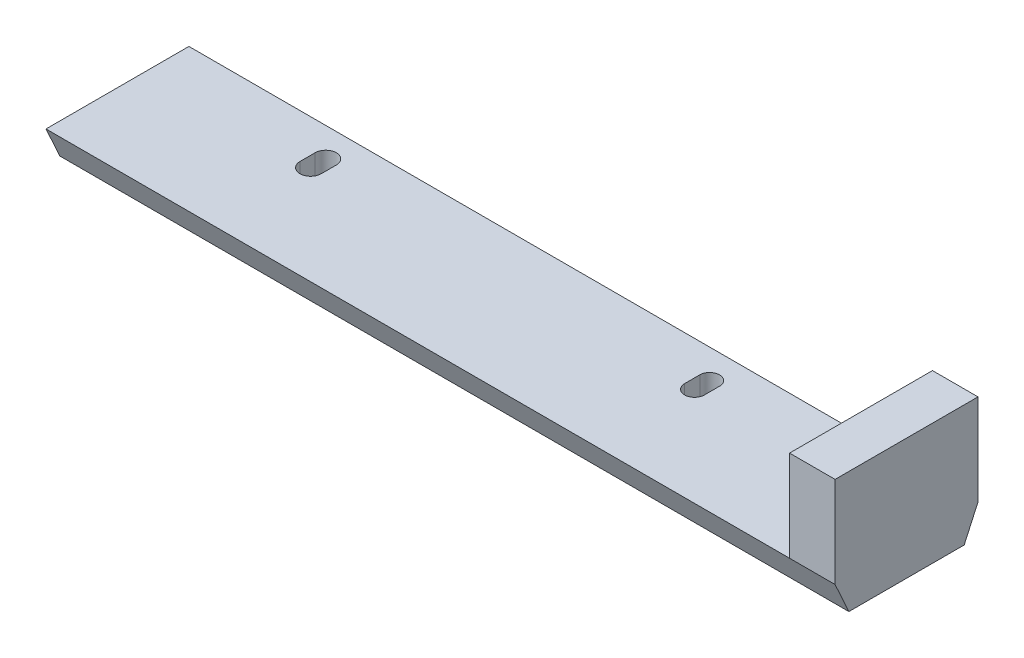
ISO-10303-21;
HEADER;
FILE_DESCRIPTION(('STEP AP214'),'2;1');
FILE_NAME('part.step','',(''),(''),'','','');
FILE_SCHEMA(('AUTOMOTIVE_DESIGN { 1 0 10303 214 1 1 1 1 }'));
ENDSEC;
DATA;
#1=APPLICATION_CONTEXT('core data for automotive mechanical design processes');
#2=APPLICATION_PROTOCOL_DEFINITION('international standard','automotive_design',2000,#1);
#3=PRODUCT_CONTEXT('',#1,'mechanical');
#4=PRODUCT('Part','Part','',(#3));
#5=PRODUCT_RELATED_PRODUCT_CATEGORY('part','',(#4));
#6=PRODUCT_DEFINITION_FORMATION('','',#4);
#7=PRODUCT_DEFINITION_CONTEXT('part definition',#1,'design');
#8=PRODUCT_DEFINITION('design','',#6,#7);
#9=PRODUCT_DEFINITION_SHAPE('','',#8);
#10=(LENGTH_UNIT() NAMED_UNIT(*) SI_UNIT(.MILLI.,.METRE.));
#11=(NAMED_UNIT(*) PLANE_ANGLE_UNIT() SI_UNIT($,.RADIAN.));
#12=(NAMED_UNIT(*) SI_UNIT($,.STERADIAN.) SOLID_ANGLE_UNIT());
#13=UNCERTAINTY_MEASURE_WITH_UNIT(LENGTH_MEASURE(1.E-05),#10,'distance_accuracy_value','');
#14=(GEOMETRIC_REPRESENTATION_CONTEXT(3) GLOBAL_UNCERTAINTY_ASSIGNED_CONTEXT((#13)) GLOBAL_UNIT_ASSIGNED_CONTEXT((#10,
#11,#12)) REPRESENTATION_CONTEXT('',''));
#15=CARTESIAN_POINT('',(0.,0.,0.));
#16=DIRECTION('',(0.,0.,1.));
#17=DIRECTION('',(1.,0.,0.));
#18=AXIS2_PLACEMENT_3D('',#15,#16,#17);
#19=CARTESIAN_POINT('',(0.,2.,0.));
#20=DIRECTION('',(0.,-1.,0.));
#21=DIRECTION('',(0.,0.,-1.));
#22=AXIS2_PLACEMENT_3D('',#19,#20,#21);
#23=PLANE('',#22);
#24=DIRECTION('',(0.,0.,1.));
#25=VECTOR('',#24,1.);
#26=CARTESIAN_POINT('',(10.2263631920337,2.,2.20000000000115));
#27=LINE('',#26,#25);
#28=CARTESIAN_POINT('',(10.2263631920337,2.,2.20000000000115));
#29=VERTEX_POINT('',#28);
#30=CARTESIAN_POINT('',(10.2263631920337,2.,3.20000000000115));
#31=VERTEX_POINT('',#30);
#32=EDGE_CURVE('E239',#29,#31,#27,.T.);
#33=ORIENTED_EDGE('',*,*,#32,.F.);
#34=CARTESIAN_POINT('',(10.9263631920337,2.,2.20000000000115));
#35=DIRECTION('',(0.,1.,0.));
#36=DIRECTION('',(0.,0.,1.));
#37=AXIS2_PLACEMENT_3D('',#34,#35,#36);
#38=CIRCLE('',#37,0.699999999999999);
#39=CARTESIAN_POINT('',(11.6263631920337,2.,2.20000000000115));
#40=VERTEX_POINT('',#39);
#41=EDGE_CURVE('E205',#40,#29,#38,.T.);
#42=ORIENTED_EDGE('',*,*,#41,.F.);
#43=DIRECTION('',(0.,0.,-1.));
#44=VECTOR('',#43,1.);
#45=CARTESIAN_POINT('',(11.6263631920337,2.,2.20000000000115));
#46=LINE('',#45,#44);
#47=CARTESIAN_POINT('',(11.6263631920337,2.,3.20000000000115));
#48=VERTEX_POINT('',#47);
#49=EDGE_CURVE('E232',#48,#40,#46,.T.);
#50=ORIENTED_EDGE('',*,*,#49,.F.);
#51=CARTESIAN_POINT('',(10.9263631920337,2.,3.20000000000115));
#52=DIRECTION('',(0.,1.,0.));
#53=DIRECTION('',(0.,0.,1.));
#54=AXIS2_PLACEMENT_3D('',#51,#52,#53);
#55=CIRCLE('',#54,0.699999999999999);
#56=EDGE_CURVE('E236',#31,#48,#55,.T.);
#57=ORIENTED_EDGE('',*,*,#56,.F.);
#58=EDGE_LOOP('',(#33,#42,#50,#57));
#59=FACE_BOUND('',#58,.T.);
#60=DIRECTION('',(0.,0.,1.));
#61=VECTOR('',#60,1.);
#62=CARTESIAN_POINT('',(35.5763631920337,2.,2.20000000000115));
#63=LINE('',#62,#61);
#64=CARTESIAN_POINT('',(35.5763631920337,2.,2.20000000000115));
#65=VERTEX_POINT('',#64);
#66=CARTESIAN_POINT('',(35.5763631920337,2.,3.20000000000115));
#67=VERTEX_POINT('',#66);
#68=EDGE_CURVE('E206',#65,#67,#63,.T.);
#69=ORIENTED_EDGE('',*,*,#68,.F.);
#70=CARTESIAN_POINT('',(36.2263631920337,2.,2.20000000000115));
#71=DIRECTION('',(0.,1.,0.));
#72=DIRECTION('',(0.,0.,1.));
#73=AXIS2_PLACEMENT_3D('',#70,#71,#72);
#74=CIRCLE('',#73,0.650000000000005);
#75=CARTESIAN_POINT('',(36.8763631920338,2.,2.20000000000115));
#76=VERTEX_POINT('',#75);
#77=EDGE_CURVE('E203',#76,#65,#74,.T.);
#78=ORIENTED_EDGE('',*,*,#77,.F.);
#79=DIRECTION('',(0.,0.,-1.));
#80=VECTOR('',#79,1.);
#81=CARTESIAN_POINT('',(36.8763631920338,2.,2.20000000000115));
#82=LINE('',#81,#80);
#83=CARTESIAN_POINT('',(36.8763631920338,2.,3.20000000000115));
#84=VERTEX_POINT('',#83);
#85=EDGE_CURVE('E192',#84,#76,#82,.T.);
#86=ORIENTED_EDGE('',*,*,#85,.F.);
#87=CARTESIAN_POINT('',(36.2263631920337,2.,3.20000000000115));
#88=DIRECTION('',(0.,1.,0.));
#89=DIRECTION('',(0.,0.,1.));
#90=AXIS2_PLACEMENT_3D('',#87,#88,#89);
#91=CIRCLE('',#90,0.650000000000005);
#92=EDGE_CURVE('E209',#67,#84,#91,.T.);
#93=ORIENTED_EDGE('',*,*,#92,.F.);
#94=EDGE_LOOP('',(#69,#78,#86,#93));
#95=FACE_BOUND('',#94,.T.);
#96=DIRECTION('',(0.,0.,1.));
#97=VECTOR('',#96,1.);
#98=CARTESIAN_POINT('',(49.,2.,0.));
#99=LINE('',#98,#97);
#100=CARTESIAN_POINT('',(49.,2.,0.290909090909087));
#101=VERTEX_POINT('',#100);
#102=CARTESIAN_POINT('',(49.,2.,9.70909090909091));
#103=VERTEX_POINT('',#102);
#104=EDGE_CURVE('E164',#101,#103,#99,.T.);
#105=ORIENTED_EDGE('',*,*,#104,.F.);
#106=DIRECTION('',(1.,0.,0.));
#107=VECTOR('',#106,1.);
#108=CARTESIAN_POINT('',(0.,2.,0.290909090909087));
#109=LINE('',#108,#107);
#110=CARTESIAN_POINT('',(0.,2.,0.290909090909087));
#111=VERTEX_POINT('',#110);
#112=EDGE_CURVE('E148',#111,#101,#109,.T.);
#113=ORIENTED_EDGE('',*,*,#112,.F.);
#114=DIRECTION('',(0.,0.,1.));
#115=VECTOR('',#114,1.);
#116=CARTESIAN_POINT('',(0.,2.,10.));
#117=LINE('',#116,#115);
#118=CARTESIAN_POINT('',(0.,2.,9.70909090909091));
#119=VERTEX_POINT('',#118);
#120=EDGE_CURVE('E162',#111,#119,#117,.T.);
#121=ORIENTED_EDGE('',*,*,#120,.T.);
#122=DIRECTION('',(1.,0.,0.));
#123=VECTOR('',#122,1.);
#124=CARTESIAN_POINT('',(0.,2.,9.70909090909091));
#125=LINE('',#124,#123);
#126=EDGE_CURVE('E264',#119,#103,#125,.T.);
#127=ORIENTED_EDGE('',*,*,#126,.T.);
#128=EDGE_LOOP('',(#105,#113,#121,#127));
#129=FACE_BOUND('',#128,.T.);
#130=ADVANCED_FACE('F39',(#59,#95,#129),#23,.F.);
#131=CARTESIAN_POINT('',(52.,2.,10.));
#132=DIRECTION('',(-1.,0.,0.));
#133=DIRECTION('',(0.,0.,1.));
#134=AXIS2_PLACEMENT_3D('',#131,#132,#133);
#135=PLANE('',#134);
#136=DIRECTION('',(0.,-0.910366477462604,0.413802944301185));
#137=VECTOR('',#136,1.);
#138=CARTESIAN_POINT('',(52.,2.,0.290909090909087));
#139=LINE('',#138,#137);
#140=CARTESIAN_POINT('',(52.,2.,0.290909090909087));
#141=VERTEX_POINT('',#140);
#142=CARTESIAN_POINT('',(52.,0.,1.2));
#143=VERTEX_POINT('',#142);
#144=EDGE_CURVE('E156',#141,#143,#139,.T.);
#145=ORIENTED_EDGE('',*,*,#144,.F.);
#146=DIRECTION('',(0.,-1.,0.));
#147=VECTOR('',#146,1.);
#148=CARTESIAN_POINT('',(52.,2.,0.290909090909087));
#149=LINE('',#148,#147);
#150=CARTESIAN_POINT('',(52.,8.,0.290909090909087));
#151=VERTEX_POINT('',#150);
#152=EDGE_CURVE('E261',#151,#141,#149,.T.);
#153=ORIENTED_EDGE('',*,*,#152,.F.);
#154=DIRECTION('',(0.,0.,-1.));
#155=VECTOR('',#154,1.);
#156=CARTESIAN_POINT('',(52.,8.,0.));
#157=LINE('',#156,#155);
#158=CARTESIAN_POINT('',(52.,8.,9.70909090909091));
#159=VERTEX_POINT('',#158);
#160=EDGE_CURVE('E183',#159,#151,#157,.T.);
#161=ORIENTED_EDGE('',*,*,#160,.F.);
#162=DIRECTION('',(0.,1.,0.));
#163=VECTOR('',#162,1.);
#164=CARTESIAN_POINT('',(52.,8.,9.70909090909091));
#165=LINE('',#164,#163);
#166=CARTESIAN_POINT('',(52.,2.,9.70909090909091));
#167=VERTEX_POINT('',#166);
#168=EDGE_CURVE('E61',#167,#159,#165,.T.);
#169=ORIENTED_EDGE('',*,*,#168,.F.);
#170=DIRECTION('',(0.,0.910366477462604,0.413802944301186));
#171=VECTOR('',#170,1.);
#172=CARTESIAN_POINT('',(52.,2.,9.70909090909091));
#173=LINE('',#172,#171);
#174=CARTESIAN_POINT('',(52.,0.,8.8));
#175=VERTEX_POINT('',#174);
#176=EDGE_CURVE('E258',#175,#167,#173,.T.);
#177=ORIENTED_EDGE('',*,*,#176,.F.);
#178=DIRECTION('',(0.,0.,-1.));
#179=VECTOR('',#178,1.);
#180=CARTESIAN_POINT('',(52.,0.,10.));
#181=LINE('',#180,#179);
#182=EDGE_CURVE('E171',#175,#143,#181,.T.);
#183=ORIENTED_EDGE('',*,*,#182,.T.);
#184=EDGE_LOOP('',(#145,#153,#161,#169,#177,#183));
#185=FACE_BOUND('',#184,.T.);
#186=ADVANCED_FACE('F41',(#185),#135,.F.);
#187=CARTESIAN_POINT('',(0.,2.,10.));
#188=DIRECTION('',(1.,0.,0.));
#189=DIRECTION('',(0.,0.,-1.));
#190=AXIS2_PLACEMENT_3D('',#187,#188,#189);
#191=PLANE('',#190);
#192=ORIENTED_EDGE('',*,*,#120,.F.);
#193=DIRECTION('',(0.,-0.910366477462604,0.413802944301185));
#194=VECTOR('',#193,1.);
#195=CARTESIAN_POINT('',(0.,2.,0.290909090909087));
#196=LINE('',#195,#194);
#197=CARTESIAN_POINT('',(0.,0.,1.2));
#198=VERTEX_POINT('',#197);
#199=EDGE_CURVE('E145',#111,#198,#196,.T.);
#200=ORIENTED_EDGE('',*,*,#199,.T.);
#201=DIRECTION('',(0.,0.,1.));
#202=VECTOR('',#201,1.);
#203=CARTESIAN_POINT('',(0.,0.,10.));
#204=LINE('',#203,#202);
#205=CARTESIAN_POINT('',(0.,0.,8.8));
#206=VERTEX_POINT('',#205);
#207=EDGE_CURVE('E169',#198,#206,#204,.T.);
#208=ORIENTED_EDGE('',*,*,#207,.T.);
#209=DIRECTION('',(0.,0.910366477462604,0.413802944301186));
#210=VECTOR('',#209,1.);
#211=CARTESIAN_POINT('',(0.,2.,9.70909090909091));
#212=LINE('',#211,#210);
#213=EDGE_CURVE('E168',#206,#119,#212,.T.);
#214=ORIENTED_EDGE('',*,*,#213,.T.);
#215=EDGE_LOOP('',(#192,#200,#208,#214));
#216=FACE_BOUND('',#215,.T.);
#217=ADVANCED_FACE('F167',(#216),#191,.F.);
#218=CARTESIAN_POINT('',(0.,0.,0.));
#219=DIRECTION('',(0.,-1.,0.));
#220=DIRECTION('',(0.,0.,-1.));
#221=AXIS2_PLACEMENT_3D('',#218,#219,#220);
#222=PLANE('',#221);
#223=DIRECTION('',(1.,0.,0.));
#224=VECTOR('',#223,1.);
#225=CARTESIAN_POINT('',(0.,0.,1.2));
#226=LINE('',#225,#224);
#227=EDGE_CURVE('E150',#198,#143,#226,.T.);
#228=ORIENTED_EDGE('',*,*,#227,.T.);
#229=ORIENTED_EDGE('',*,*,#182,.F.);
#230=DIRECTION('',(1.,0.,0.));
#231=VECTOR('',#230,1.);
#232=CARTESIAN_POINT('',(0.,0.,8.8));
#233=LINE('',#232,#231);
#234=EDGE_CURVE('E259',#206,#175,#233,.T.);
#235=ORIENTED_EDGE('',*,*,#234,.F.);
#236=ORIENTED_EDGE('',*,*,#207,.F.);
#237=EDGE_LOOP('',(#228,#229,#235,#236));
#238=FACE_BOUND('',#237,.T.);
#239=CARTESIAN_POINT('',(10.9263631920337,0.,2.20000000000115));
#240=DIRECTION('',(0.,1.,0.));
#241=DIRECTION('',(0.,0.,1.));
#242=AXIS2_PLACEMENT_3D('',#239,#240,#241);
#243=CIRCLE('',#242,0.699999999999999);
#244=CARTESIAN_POINT('',(11.6263631920337,0.,2.20000000000115));
#245=VERTEX_POINT('',#244);
#246=CARTESIAN_POINT('',(10.2263631920337,0.,2.20000000000115));
#247=VERTEX_POINT('',#246);
#248=EDGE_CURVE('E235',#245,#247,#243,.T.);
#249=ORIENTED_EDGE('',*,*,#248,.T.);
#250=DIRECTION('',(0.,0.,1.));
#251=VECTOR('',#250,1.);
#252=CARTESIAN_POINT('',(10.2263631920337,0.,2.20000000000115));
#253=LINE('',#252,#251);
#254=CARTESIAN_POINT('',(10.2263631920337,0.,3.20000000000115));
#255=VERTEX_POINT('',#254);
#256=EDGE_CURVE('E248',#247,#255,#253,.T.);
#257=ORIENTED_EDGE('',*,*,#256,.T.);
#258=CARTESIAN_POINT('',(10.9263631920337,0.,3.20000000000115));
#259=DIRECTION('',(0.,1.,0.));
#260=DIRECTION('',(0.,0.,1.));
#261=AXIS2_PLACEMENT_3D('',#258,#259,#260);
#262=CIRCLE('',#261,0.699999999999999);
#263=CARTESIAN_POINT('',(11.6263631920337,0.,3.20000000000115));
#264=VERTEX_POINT('',#263);
#265=EDGE_CURVE('E245',#255,#264,#262,.T.);
#266=ORIENTED_EDGE('',*,*,#265,.T.);
#267=DIRECTION('',(0.,0.,-1.));
#268=VECTOR('',#267,1.);
#269=CARTESIAN_POINT('',(11.6263631920337,0.,2.20000000000115));
#270=LINE('',#269,#268);
#271=EDGE_CURVE('E226',#264,#245,#270,.T.);
#272=ORIENTED_EDGE('',*,*,#271,.T.);
#273=EDGE_LOOP('',(#249,#257,#266,#272));
#274=FACE_BOUND('',#273,.T.);
#275=CARTESIAN_POINT('',(36.2263631920337,0.,2.20000000000115));
#276=DIRECTION('',(0.,1.,0.));
#277=DIRECTION('',(0.,0.,1.));
#278=AXIS2_PLACEMENT_3D('',#275,#276,#277);
#279=CIRCLE('',#278,0.650000000000005);
#280=CARTESIAN_POINT('',(36.8763631920338,0.,2.20000000000115));
#281=VERTEX_POINT('',#280);
#282=CARTESIAN_POINT('',(35.5763631920337,0.,2.20000000000115));
#283=VERTEX_POINT('',#282);
#284=EDGE_CURVE('E189',#281,#283,#279,.T.);
#285=ORIENTED_EDGE('',*,*,#284,.T.);
#286=DIRECTION('',(0.,0.,1.));
#287=VECTOR('',#286,1.);
#288=CARTESIAN_POINT('',(35.5763631920337,0.,2.20000000000115));
#289=LINE('',#288,#287);
#290=CARTESIAN_POINT('',(35.5763631920337,0.,3.20000000000115));
#291=VERTEX_POINT('',#290);
#292=EDGE_CURVE('E193',#283,#291,#289,.T.);
#293=ORIENTED_EDGE('',*,*,#292,.T.);
#294=CARTESIAN_POINT('',(36.2263631920337,0.,3.20000000000115));
#295=DIRECTION('',(0.,1.,0.));
#296=DIRECTION('',(0.,0.,1.));
#297=AXIS2_PLACEMENT_3D('',#294,#295,#296);
#298=CIRCLE('',#297,0.650000000000005);
#299=CARTESIAN_POINT('',(36.8763631920338,0.,3.20000000000115));
#300=VERTEX_POINT('',#299);
#301=EDGE_CURVE('E196',#291,#300,#298,.T.);
#302=ORIENTED_EDGE('',*,*,#301,.T.);
#303=DIRECTION('',(0.,0.,-1.));
#304=VECTOR('',#303,1.);
#305=CARTESIAN_POINT('',(36.8763631920338,0.,2.20000000000115));
#306=LINE('',#305,#304);
#307=EDGE_CURVE('E199',#300,#281,#306,.T.);
#308=ORIENTED_EDGE('',*,*,#307,.T.);
#309=EDGE_LOOP('',(#285,#293,#302,#308));
#310=FACE_BOUND('',#309,.T.);
#311=ADVANCED_FACE('F275',(#238,#274,#310),#222,.T.);
#312=CARTESIAN_POINT('',(49.,8.,0.));
#313=DIRECTION('',(1.,0.,0.));
#314=DIRECTION('',(0.,0.,-1.));
#315=AXIS2_PLACEMENT_3D('',#312,#313,#314);
#316=PLANE('',#315);
#317=DIRECTION('',(0.,0.,1.));
#318=VECTOR('',#317,1.);
#319=CARTESIAN_POINT('',(49.,8.,0.));
#320=LINE('',#319,#318);
#321=CARTESIAN_POINT('',(49.,8.,0.290909090909087));
#322=VERTEX_POINT('',#321);
#323=CARTESIAN_POINT('',(49.,8.,9.70909090909091));
#324=VERTEX_POINT('',#323);
#325=EDGE_CURVE('E177',#322,#324,#320,.T.);
#326=ORIENTED_EDGE('',*,*,#325,.F.);
#327=DIRECTION('',(0.,-1.,0.));
#328=VECTOR('',#327,1.);
#329=CARTESIAN_POINT('',(49.,8.,0.290909090909087));
#330=LINE('',#329,#328);
#331=EDGE_CURVE('E54',#322,#101,#330,.T.);
#332=ORIENTED_EDGE('',*,*,#331,.T.);
#333=ORIENTED_EDGE('',*,*,#104,.T.);
#334=DIRECTION('',(0.,1.,0.));
#335=VECTOR('',#334,1.);
#336=CARTESIAN_POINT('',(49.,8.,9.70909090909091));
#337=LINE('',#336,#335);
#338=EDGE_CURVE('E254',#103,#324,#337,.T.);
#339=ORIENTED_EDGE('',*,*,#338,.T.);
#340=EDGE_LOOP('',(#326,#332,#333,#339));
#341=FACE_BOUND('',#340,.T.);
#342=ADVANCED_FACE('F284',(#341),#316,.F.);
#343=CARTESIAN_POINT('',(0.,8.,0.));
#344=DIRECTION('',(0.,-1.,0.));
#345=DIRECTION('',(0.,0.,-1.));
#346=AXIS2_PLACEMENT_3D('',#343,#344,#345);
#347=PLANE('',#346);
#348=ORIENTED_EDGE('',*,*,#160,.T.);
#349=DIRECTION('',(-1.,0.,0.));
#350=VECTOR('',#349,1.);
#351=CARTESIAN_POINT('',(0.,8.,0.290909090909087));
#352=LINE('',#351,#350);
#353=EDGE_CURVE('E11',#151,#322,#352,.T.);
#354=ORIENTED_EDGE('',*,*,#353,.T.);
#355=ORIENTED_EDGE('',*,*,#325,.T.);
#356=DIRECTION('',(1.,0.,0.));
#357=VECTOR('',#356,1.);
#358=CARTESIAN_POINT('',(0.,8.,9.70909090909091));
#359=LINE('',#358,#357);
#360=EDGE_CURVE('E47',#324,#159,#359,.T.);
#361=ORIENTED_EDGE('',*,*,#360,.T.);
#362=EDGE_LOOP('',(#348,#354,#355,#361));
#363=FACE_BOUND('',#362,.T.);
#364=ADVANCED_FACE('F281',(#363),#347,.F.);
#365=CARTESIAN_POINT('',(36.2263631920337,0.,2.20000000000115));
#366=DIRECTION('',(0.,1.,0.));
#367=DIRECTION('',(0.,0.,1.));
#368=AXIS2_PLACEMENT_3D('',#365,#366,#367);
#369=CYLINDRICAL_SURFACE('',#368,0.650000000000005);
#370=ORIENTED_EDGE('',*,*,#77,.T.);
#371=DIRECTION('',(0.,1.,0.));
#372=VECTOR('',#371,1.);
#373=CARTESIAN_POINT('',(35.5763631920337,0.,2.20000000000115));
#374=LINE('',#373,#372);
#375=EDGE_CURVE('E202',#283,#65,#374,.T.);
#376=ORIENTED_EDGE('',*,*,#375,.F.);
#377=ORIENTED_EDGE('',*,*,#284,.F.);
#378=DIRECTION('',(0.,1.,0.));
#379=VECTOR('',#378,1.);
#380=CARTESIAN_POINT('',(36.8763631920338,0.,2.20000000000115));
#381=LINE('',#380,#379);
#382=EDGE_CURVE('E214',#281,#76,#381,.T.);
#383=ORIENTED_EDGE('',*,*,#382,.T.);
#384=EDGE_LOOP('',(#370,#376,#377,#383));
#385=FACE_BOUND('',#384,.T.);
#386=ADVANCED_FACE('F291',(#385),#369,.F.);
#387=CARTESIAN_POINT('',(36.8763631920338,0.,2.20000000000115));
#388=DIRECTION('',(1.,0.,0.));
#389=DIRECTION('',(0.,0.,-1.));
#390=AXIS2_PLACEMENT_3D('',#387,#388,#389);
#391=PLANE('',#390);
#392=ORIENTED_EDGE('',*,*,#85,.T.);
#393=ORIENTED_EDGE('',*,*,#382,.F.);
#394=ORIENTED_EDGE('',*,*,#307,.F.);
#395=DIRECTION('',(0.,1.,0.));
#396=VECTOR('',#395,1.);
#397=CARTESIAN_POINT('',(36.8763631920338,0.,3.20000000000115));
#398=LINE('',#397,#396);
#399=EDGE_CURVE('E216',#300,#84,#398,.T.);
#400=ORIENTED_EDGE('',*,*,#399,.T.);
#401=EDGE_LOOP('',(#392,#393,#394,#400));
#402=FACE_BOUND('',#401,.T.);
#403=ADVANCED_FACE('F428',(#402),#391,.F.);
#404=CARTESIAN_POINT('',(36.2263631920337,0.,3.20000000000115));
#405=DIRECTION('',(0.,1.,0.));
#406=DIRECTION('',(0.,0.,1.));
#407=AXIS2_PLACEMENT_3D('',#404,#405,#406);
#408=CYLINDRICAL_SURFACE('',#407,0.650000000000005);
#409=ORIENTED_EDGE('',*,*,#92,.T.);
#410=ORIENTED_EDGE('',*,*,#399,.F.);
#411=ORIENTED_EDGE('',*,*,#301,.F.);
#412=DIRECTION('',(0.,1.,0.));
#413=VECTOR('',#412,1.);
#414=CARTESIAN_POINT('',(35.5763631920337,0.,3.20000000000115));
#415=LINE('',#414,#413);
#416=EDGE_CURVE('E218',#291,#67,#415,.T.);
#417=ORIENTED_EDGE('',*,*,#416,.T.);
#418=EDGE_LOOP('',(#409,#410,#411,#417));
#419=FACE_BOUND('',#418,.T.);
#420=ADVANCED_FACE('F418',(#419),#408,.F.);
#421=CARTESIAN_POINT('',(35.5763631920337,0.,2.20000000000115));
#422=DIRECTION('',(-1.,0.,0.));
#423=DIRECTION('',(0.,0.,1.));
#424=AXIS2_PLACEMENT_3D('',#421,#422,#423);
#425=PLANE('',#424);
#426=ORIENTED_EDGE('',*,*,#68,.T.);
#427=ORIENTED_EDGE('',*,*,#416,.F.);
#428=ORIENTED_EDGE('',*,*,#292,.F.);
#429=ORIENTED_EDGE('',*,*,#375,.T.);
#430=EDGE_LOOP('',(#426,#427,#428,#429));
#431=FACE_BOUND('',#430,.T.);
#432=ADVANCED_FACE('F408',(#431),#425,.F.);
#433=CARTESIAN_POINT('',(10.9263631920337,0.,2.20000000000115));
#434=DIRECTION('',(0.,1.,0.));
#435=DIRECTION('',(0.,0.,1.));
#436=AXIS2_PLACEMENT_3D('',#433,#434,#435);
#437=CYLINDRICAL_SURFACE('',#436,0.699999999999999);
#438=ORIENTED_EDGE('',*,*,#41,.T.);
#439=DIRECTION('',(0.,1.,0.));
#440=VECTOR('',#439,1.);
#441=CARTESIAN_POINT('',(10.2263631920337,0.,2.20000000000115));
#442=LINE('',#441,#440);
#443=EDGE_CURVE('E222',#247,#29,#442,.T.);
#444=ORIENTED_EDGE('',*,*,#443,.F.);
#445=ORIENTED_EDGE('',*,*,#248,.F.);
#446=DIRECTION('',(0.,1.,0.));
#447=VECTOR('',#446,1.);
#448=CARTESIAN_POINT('',(11.6263631920337,0.,2.20000000000115));
#449=LINE('',#448,#447);
#450=EDGE_CURVE('E230',#245,#40,#449,.T.);
#451=ORIENTED_EDGE('',*,*,#450,.T.);
#452=EDGE_LOOP('',(#438,#444,#445,#451));
#453=FACE_BOUND('',#452,.T.);
#454=ADVANCED_FACE('F398',(#453),#437,.F.);
#455=CARTESIAN_POINT('',(11.6263631920337,0.,2.20000000000115));
#456=DIRECTION('',(1.,0.,0.));
#457=DIRECTION('',(0.,0.,-1.));
#458=AXIS2_PLACEMENT_3D('',#455,#456,#457);
#459=PLANE('',#458);
#460=ORIENTED_EDGE('',*,*,#49,.T.);
#461=ORIENTED_EDGE('',*,*,#450,.F.);
#462=ORIENTED_EDGE('',*,*,#271,.F.);
#463=DIRECTION('',(0.,1.,0.));
#464=VECTOR('',#463,1.);
#465=CARTESIAN_POINT('',(11.6263631920337,0.,3.20000000000115));
#466=LINE('',#465,#464);
#467=EDGE_CURVE('E228',#264,#48,#466,.T.);
#468=ORIENTED_EDGE('',*,*,#467,.T.);
#469=EDGE_LOOP('',(#460,#461,#462,#468));
#470=FACE_BOUND('',#469,.T.);
#471=ADVANCED_FACE('F388',(#470),#459,.F.);
#472=CARTESIAN_POINT('',(10.9263631920337,0.,3.20000000000115));
#473=DIRECTION('',(0.,1.,0.));
#474=DIRECTION('',(0.,0.,1.));
#475=AXIS2_PLACEMENT_3D('',#472,#473,#474);
#476=CYLINDRICAL_SURFACE('',#475,0.699999999999999);
#477=ORIENTED_EDGE('',*,*,#56,.T.);
#478=ORIENTED_EDGE('',*,*,#467,.F.);
#479=ORIENTED_EDGE('',*,*,#265,.F.);
#480=DIRECTION('',(0.,1.,0.));
#481=VECTOR('',#480,1.);
#482=CARTESIAN_POINT('',(10.2263631920337,0.,3.20000000000115));
#483=LINE('',#482,#481);
#484=EDGE_CURVE('E225',#255,#31,#483,.T.);
#485=ORIENTED_EDGE('',*,*,#484,.T.);
#486=EDGE_LOOP('',(#477,#478,#479,#485));
#487=FACE_BOUND('',#486,.T.);
#488=ADVANCED_FACE('F378',(#487),#476,.F.);
#489=CARTESIAN_POINT('',(10.2263631920337,0.,2.20000000000115));
#490=DIRECTION('',(-1.,0.,0.));
#491=DIRECTION('',(0.,0.,1.));
#492=AXIS2_PLACEMENT_3D('',#489,#490,#491);
#493=PLANE('',#492);
#494=ORIENTED_EDGE('',*,*,#32,.T.);
#495=ORIENTED_EDGE('',*,*,#484,.F.);
#496=ORIENTED_EDGE('',*,*,#256,.F.);
#497=ORIENTED_EDGE('',*,*,#443,.T.);
#498=EDGE_LOOP('',(#494,#495,#496,#497));
#499=FACE_BOUND('',#498,.T.);
#500=ADVANCED_FACE('F337',(#499),#493,.F.);
#501=CARTESIAN_POINT('',(0.,8.,9.70909090909091));
#502=DIRECTION('',(0.,0.,-1.));
#503=DIRECTION('',(-1.,0.,0.));
#504=AXIS2_PLACEMENT_3D('',#501,#502,#503);
#505=PLANE('',#504);
#506=EDGE_CURVE('E266',#103,#167,#125,.T.);
#507=ORIENTED_EDGE('',*,*,#506,.T.);
#508=ORIENTED_EDGE('',*,*,#168,.T.);
#509=ORIENTED_EDGE('',*,*,#360,.F.);
#510=ORIENTED_EDGE('',*,*,#338,.F.);
#511=EDGE_LOOP('',(#507,#508,#509,#510));
#512=FACE_BOUND('',#511,.T.);
#513=ADVANCED_FACE('F282',(#512),#505,.F.);
#514=CARTESIAN_POINT('',(0.,2.,9.70909090909091));
#515=DIRECTION('',(0.,0.413802944301185,-0.910366477462604));
#516=DIRECTION('',(0.,0.910366477462604,0.413802944301186));
#517=AXIS2_PLACEMENT_3D('',#514,#515,#516);
#518=PLANE('',#517);
#519=ORIENTED_EDGE('',*,*,#176,.T.);
#520=ORIENTED_EDGE('',*,*,#506,.F.);
#521=ORIENTED_EDGE('',*,*,#126,.F.);
#522=ORIENTED_EDGE('',*,*,#213,.F.);
#523=ORIENTED_EDGE('',*,*,#234,.T.);
#524=EDGE_LOOP('',(#519,#520,#521,#522,#523));
#525=FACE_BOUND('',#524,.T.);
#526=ADVANCED_FACE('F279',(#525),#518,.F.);
#527=CARTESIAN_POINT('',(0.,2.,0.290909090909087));
#528=DIRECTION('',(0.,0.,1.));
#529=DIRECTION('',(0.,-1.,0.));
#530=AXIS2_PLACEMENT_3D('',#527,#528,#529);
#531=PLANE('',#530);
#532=ORIENTED_EDGE('',*,*,#353,.F.);
#533=ORIENTED_EDGE('',*,*,#152,.T.);
#534=EDGE_CURVE('E155',#101,#141,#109,.T.);
#535=ORIENTED_EDGE('',*,*,#534,.F.);
#536=ORIENTED_EDGE('',*,*,#331,.F.);
#537=EDGE_LOOP('',(#532,#533,#535,#536));
#538=FACE_BOUND('',#537,.T.);
#539=ADVANCED_FACE('F272',(#538),#531,.F.);
#540=CARTESIAN_POINT('',(0.,2.,0.290909090909087));
#541=DIRECTION('',(0.,0.413802944301185,0.910366477462604));
#542=DIRECTION('',(0.,-0.910366477462604,0.413802944301185));
#543=AXIS2_PLACEMENT_3D('',#540,#541,#542);
#544=PLANE('',#543);
#545=ORIENTED_EDGE('',*,*,#144,.T.);
#546=ORIENTED_EDGE('',*,*,#227,.F.);
#547=ORIENTED_EDGE('',*,*,#199,.F.);
#548=ORIENTED_EDGE('',*,*,#112,.T.);
#549=ORIENTED_EDGE('',*,*,#534,.T.);
#550=EDGE_LOOP('',(#545,#546,#547,#548,#549));
#551=FACE_BOUND('',#550,.T.);
#552=ADVANCED_FACE('F147',(#551),#544,.F.);
#553=CLOSED_SHELL('',(#130,#186,#217,#311,#342,#364,#386,#403,#420,#432,#454,#471,#488,#500,
#513,#526,#539,#552));
#554=MANIFOLD_SOLID_BREP('B2',#553);
#555=ADVANCED_BREP_SHAPE_REPRESENTATION('',(#18,#554),#14);
#556=SHAPE_DEFINITION_REPRESENTATION(#9,#555);
ENDSEC;
END-ISO-10303-21;
